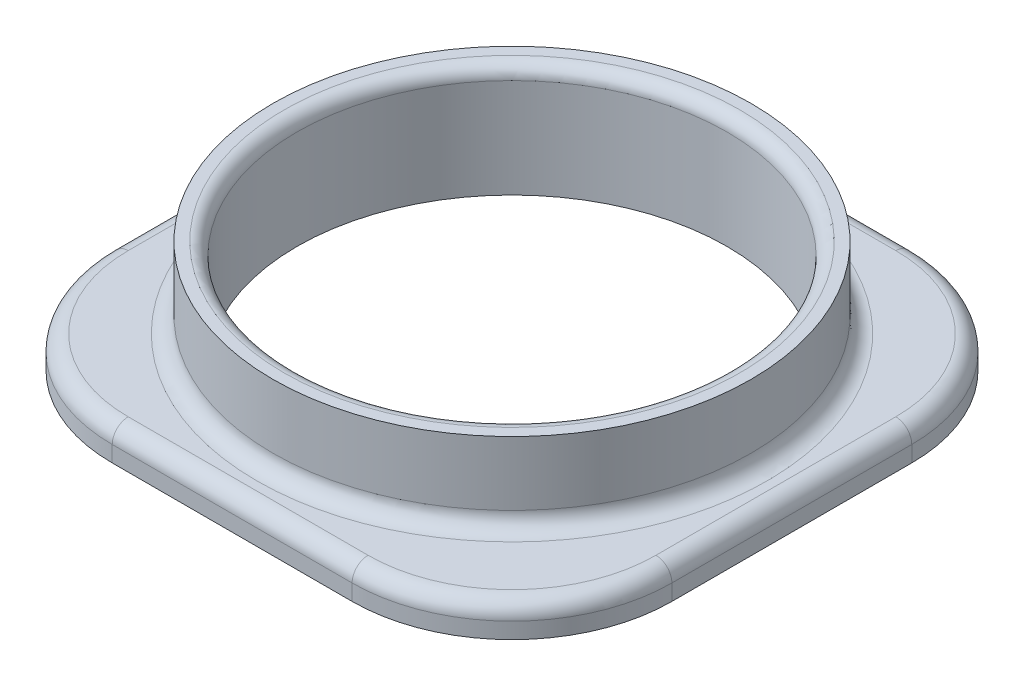
ISO-10303-21;
HEADER;
FILE_DESCRIPTION(('STEP AP214'),'2;1');
FILE_NAME('part.step','',(''),(''),'','','');
FILE_SCHEMA(('AUTOMOTIVE_DESIGN { 1 0 10303 214 1 1 1 1 }'));
ENDSEC;
DATA;
#1=APPLICATION_CONTEXT('core data for automotive mechanical design processes');
#2=APPLICATION_PROTOCOL_DEFINITION('international standard','automotive_design',2000,#1);
#3=PRODUCT_CONTEXT('',#1,'mechanical');
#4=PRODUCT('Part','Part','',(#3));
#5=PRODUCT_RELATED_PRODUCT_CATEGORY('part','',(#4));
#6=PRODUCT_DEFINITION_FORMATION('','',#4);
#7=PRODUCT_DEFINITION_CONTEXT('part definition',#1,'design');
#8=PRODUCT_DEFINITION('design','',#6,#7);
#9=PRODUCT_DEFINITION_SHAPE('','',#8);
#10=(LENGTH_UNIT() NAMED_UNIT(*) SI_UNIT(.MILLI.,.METRE.));
#11=(NAMED_UNIT(*) PLANE_ANGLE_UNIT() SI_UNIT($,.RADIAN.));
#12=(NAMED_UNIT(*) SI_UNIT($,.STERADIAN.) SOLID_ANGLE_UNIT());
#13=UNCERTAINTY_MEASURE_WITH_UNIT(LENGTH_MEASURE(1.E-05),#10,'distance_accuracy_value','');
#14=(GEOMETRIC_REPRESENTATION_CONTEXT(3) GLOBAL_UNCERTAINTY_ASSIGNED_CONTEXT((#13)) GLOBAL_UNIT_ASSIGNED_CONTEXT((#10,
#11,#12)) REPRESENTATION_CONTEXT('',''));
#15=CARTESIAN_POINT('',(0.,0.,0.));
#16=DIRECTION('',(0.,0.,1.));
#17=DIRECTION('',(1.,0.,0.));
#18=AXIS2_PLACEMENT_3D('',#15,#16,#17);
#19=CARTESIAN_POINT('',(0.,5.,0.));
#20=DIRECTION('',(0.,1.,0.));
#21=DIRECTION('',(0.,0.,1.));
#22=AXIS2_PLACEMENT_3D('',#19,#20,#21);
#23=PLANE('',#22);
#24=CARTESIAN_POINT('',(0.,5.,0.));
#25=DIRECTION('',(0.,1.,0.));
#26=DIRECTION('',(0.,0.,1.));
#27=AXIS2_PLACEMENT_3D('',#24,#25,#26);
#28=CIRCLE('',#27,14.25);
#29=CARTESIAN_POINT('',(0.,5.,14.25));
#30=VERTEX_POINT('',#29);
#31=EDGE_CURVE('E183',#30,#30,#28,.F.);
#32=ORIENTED_EDGE('',*,*,#31,.T.);
#33=EDGE_LOOP('',(#32));
#34=FACE_BOUND('',#33,.T.);
#35=CARTESIAN_POINT('',(0.,5.,0.));
#36=DIRECTION('',(0.,1.,0.));
#37=DIRECTION('',(0.,0.,1.));
#38=AXIS2_PLACEMENT_3D('',#35,#36,#37);
#39=CIRCLE('',#38,14.95);
#40=CARTESIAN_POINT('',(0.,5.,14.95));
#41=VERTEX_POINT('',#40);
#42=EDGE_CURVE('E169',#41,#41,#39,.T.);
#43=ORIENTED_EDGE('',*,*,#42,.T.);
#44=EDGE_LOOP('',(#43));
#45=FACE_BOUND('',#44,.T.);
#46=ADVANCED_FACE('F47',(#34,#45),#23,.T.);
#47=CARTESIAN_POINT('',(0.,5.,0.));
#48=DIRECTION('',(0.,-1.,0.));
#49=DIRECTION('',(0.,0.,-1.));
#50=AXIS2_PLACEMENT_3D('',#47,#48,#49);
#51=CYLINDRICAL_SURFACE('',#50,14.95);
#52=CARTESIAN_POINT('',(0.,1.,0.));
#53=DIRECTION('',(0.,1.,0.));
#54=DIRECTION('',(0.,0.,1.));
#55=AXIS2_PLACEMENT_3D('',#52,#53,#54);
#56=CIRCLE('',#55,14.95);
#57=CARTESIAN_POINT('',(0.,1.,14.95));
#58=VERTEX_POINT('',#57);
#59=EDGE_CURVE('E11',#58,#58,#56,.T.);
#60=ORIENTED_EDGE('',*,*,#59,.T.);
#61=EDGE_LOOP('',(#60));
#62=FACE_BOUND('',#61,.T.);
#63=ORIENTED_EDGE('',*,*,#42,.F.);
#64=EDGE_LOOP('',(#63));
#65=FACE_BOUND('',#64,.T.);
#66=ADVANCED_FACE('F367',(#62,#65),#51,.T.);
#67=CARTESIAN_POINT('',(0.,5.,0.));
#68=DIRECTION('',(0.,-1.,0.));
#69=DIRECTION('',(0.,0.,-1.));
#70=AXIS2_PLACEMENT_3D('',#67,#68,#69);
#71=CYLINDRICAL_SURFACE('',#70,13.45);
#72=CARTESIAN_POINT('',(0.,4.2,0.));
#73=DIRECTION('',(0.,1.,0.));
#74=DIRECTION('',(0.,0.,1.));
#75=AXIS2_PLACEMENT_3D('',#72,#73,#74);
#76=CIRCLE('',#75,13.45);
#77=CARTESIAN_POINT('',(0.,4.2,13.45));
#78=VERTEX_POINT('',#77);
#79=EDGE_CURVE('E174',#78,#78,#76,.T.);
#80=ORIENTED_EDGE('',*,*,#79,.T.);
#81=EDGE_LOOP('',(#80));
#82=FACE_BOUND('',#81,.T.);
#83=CARTESIAN_POINT('',(0.,-2.,0.));
#84=DIRECTION('',(0.,-1.,0.));
#85=DIRECTION('',(0.,0.,-1.));
#86=AXIS2_PLACEMENT_3D('',#83,#84,#85);
#87=CIRCLE('',#86,13.45);
#88=CARTESIAN_POINT('',(0.,-2.,-13.45));
#89=VERTEX_POINT('',#88);
#90=EDGE_CURVE('E164',#89,#89,#87,.T.);
#91=ORIENTED_EDGE('',*,*,#90,.T.);
#92=EDGE_LOOP('',(#91));
#93=FACE_BOUND('',#92,.T.);
#94=ADVANCED_FACE('F375',(#82,#93),#71,.F.);
#95=CARTESIAN_POINT('',(-7.5,-2.,-7.50000000000001));
#96=DIRECTION('',(0.,1.,0.));
#97=DIRECTION('',(0.,0.,1.));
#98=AXIS2_PLACEMENT_3D('',#95,#96,#97);
#99=PLANE('',#98);
#100=CARTESIAN_POINT('',(-7.5,-2.,-7.50000000000001));
#101=DIRECTION('',(0.,-1.,0.));
#102=DIRECTION('',(0.,0.,1.));
#103=AXIS2_PLACEMENT_3D('',#100,#101,#102);
#104=CIRCLE('',#103,10.);
#105=CARTESIAN_POINT('',(-17.5,-2.,-7.50000000000001));
#106=VERTEX_POINT('',#105);
#107=CARTESIAN_POINT('',(-7.5,-2.,-17.5));
#108=VERTEX_POINT('',#107);
#109=EDGE_CURVE('E155',#106,#108,#104,.T.);
#110=ORIENTED_EDGE('',*,*,#109,.T.);
#111=DIRECTION('',(1.,0.,0.));
#112=VECTOR('',#111,1.);
#113=CARTESIAN_POINT('',(-7.5,-2.,-17.5));
#114=LINE('',#113,#112);
#115=CARTESIAN_POINT('',(7.5,-2.,-17.5));
#116=VERTEX_POINT('',#115);
#117=EDGE_CURVE('E142',#108,#116,#114,.T.);
#118=ORIENTED_EDGE('',*,*,#117,.T.);
#119=CARTESIAN_POINT('',(7.5,-2.,-7.50000000000001));
#120=DIRECTION('',(0.,-1.,0.));
#121=DIRECTION('',(0.,0.,-1.));
#122=AXIS2_PLACEMENT_3D('',#119,#120,#121);
#123=CIRCLE('',#122,10.);
#124=CARTESIAN_POINT('',(17.5,-2.,-7.50000000000001));
#125=VERTEX_POINT('',#124);
#126=EDGE_CURVE('E154',#116,#125,#123,.T.);
#127=ORIENTED_EDGE('',*,*,#126,.T.);
#128=DIRECTION('',(0.,0.,1.));
#129=VECTOR('',#128,1.);
#130=CARTESIAN_POINT('',(17.5,-2.,-7.50000000000001));
#131=LINE('',#130,#129);
#132=CARTESIAN_POINT('',(17.5,-2.,7.5));
#133=VERTEX_POINT('',#132);
#134=EDGE_CURVE('E278',#125,#133,#131,.T.);
#135=ORIENTED_EDGE('',*,*,#134,.T.);
#136=CARTESIAN_POINT('',(7.5,-2.,7.5));
#137=DIRECTION('',(0.,-1.,0.));
#138=DIRECTION('',(0.,0.,1.));
#139=AXIS2_PLACEMENT_3D('',#136,#137,#138);
#140=CIRCLE('',#139,10.);
#141=CARTESIAN_POINT('',(7.5,-2.,17.5));
#142=VERTEX_POINT('',#141);
#143=EDGE_CURVE('E281',#133,#142,#140,.T.);
#144=ORIENTED_EDGE('',*,*,#143,.T.);
#145=DIRECTION('',(-1.,0.,0.));
#146=VECTOR('',#145,1.);
#147=CARTESIAN_POINT('',(-7.5,-2.,17.5));
#148=LINE('',#147,#146);
#149=CARTESIAN_POINT('',(-7.5,-2.,17.5));
#150=VERTEX_POINT('',#149);
#151=EDGE_CURVE('E284',#142,#150,#148,.T.);
#152=ORIENTED_EDGE('',*,*,#151,.T.);
#153=CARTESIAN_POINT('',(-7.5,-2.,7.5));
#154=DIRECTION('',(0.,-1.,0.));
#155=DIRECTION('',(0.,0.,1.));
#156=AXIS2_PLACEMENT_3D('',#153,#154,#155);
#157=CIRCLE('',#156,10.);
#158=CARTESIAN_POINT('',(-17.5,-2.,7.5));
#159=VERTEX_POINT('',#158);
#160=EDGE_CURVE('E287',#150,#159,#157,.T.);
#161=ORIENTED_EDGE('',*,*,#160,.T.);
#162=DIRECTION('',(0.,0.,-1.));
#163=VECTOR('',#162,1.);
#164=CARTESIAN_POINT('',(-17.5,-2.,-7.50000000000001));
#165=LINE('',#164,#163);
#166=EDGE_CURVE('E161',#159,#106,#165,.T.);
#167=ORIENTED_EDGE('',*,*,#166,.T.);
#168=EDGE_LOOP('',(#110,#118,#127,#135,#144,#152,#161,#167));
#169=FACE_BOUND('',#168,.T.);
#170=ORIENTED_EDGE('',*,*,#90,.F.);
#171=EDGE_LOOP('',(#170));
#172=FACE_BOUND('',#171,.T.);
#173=ADVANCED_FACE('F158',(#169,#172),#99,.F.);
#174=CARTESIAN_POINT('',(-7.5,0.,-7.50000000000001));
#175=DIRECTION('',(0.,1.,0.));
#176=DIRECTION('',(0.,0.,1.));
#177=AXIS2_PLACEMENT_3D('',#174,#175,#176);
#178=PLANE('',#177);
#179=CARTESIAN_POINT('',(7.5,0.,-7.50000000000001));
#180=DIRECTION('',(0.,1.,0.));
#181=DIRECTION('',(0.,0.,1.));
#182=AXIS2_PLACEMENT_3D('',#179,#180,#181);
#183=CIRCLE('',#182,9.);
#184=CARTESIAN_POINT('',(16.5,0.,-7.50000000000001));
#185=VERTEX_POINT('',#184);
#186=CARTESIAN_POINT('',(7.5,0.,-16.5));
#187=VERTEX_POINT('',#186);
#188=EDGE_CURVE('E212',#185,#187,#183,.T.);
#189=ORIENTED_EDGE('',*,*,#188,.T.);
#190=DIRECTION('',(1.,0.,0.));
#191=VECTOR('',#190,1.);
#192=CARTESIAN_POINT('',(-7.5,0.,-16.5));
#193=LINE('',#192,#191);
#194=CARTESIAN_POINT('',(-7.5,0.,-16.5));
#195=VERTEX_POINT('',#194);
#196=EDGE_CURVE('E215',#187,#195,#193,.F.);
#197=ORIENTED_EDGE('',*,*,#196,.T.);
#198=CARTESIAN_POINT('',(-7.5,0.,-7.50000000000001));
#199=DIRECTION('',(0.,1.,0.));
#200=DIRECTION('',(0.,0.,1.));
#201=AXIS2_PLACEMENT_3D('',#198,#199,#200);
#202=CIRCLE('',#201,9.);
#203=CARTESIAN_POINT('',(-16.5,0.,-7.50000000000001));
#204=VERTEX_POINT('',#203);
#205=EDGE_CURVE('E194',#195,#204,#202,.T.);
#206=ORIENTED_EDGE('',*,*,#205,.T.);
#207=DIRECTION('',(0.,0.,-1.));
#208=VECTOR('',#207,1.);
#209=CARTESIAN_POINT('',(-16.5,0.,7.5));
#210=LINE('',#209,#208);
#211=CARTESIAN_POINT('',(-16.5,0.,7.5));
#212=VERTEX_POINT('',#211);
#213=EDGE_CURVE('E197',#204,#212,#210,.F.);
#214=ORIENTED_EDGE('',*,*,#213,.T.);
#215=CARTESIAN_POINT('',(-7.5,0.,7.5));
#216=DIRECTION('',(0.,1.,0.));
#217=DIRECTION('',(0.,0.,1.));
#218=AXIS2_PLACEMENT_3D('',#215,#216,#217);
#219=CIRCLE('',#218,9.);
#220=CARTESIAN_POINT('',(-7.5,0.,16.5));
#221=VERTEX_POINT('',#220);
#222=EDGE_CURVE('E200',#212,#221,#219,.T.);
#223=ORIENTED_EDGE('',*,*,#222,.T.);
#224=DIRECTION('',(-1.,0.,0.));
#225=VECTOR('',#224,1.);
#226=CARTESIAN_POINT('',(7.5,0.,16.5));
#227=LINE('',#226,#225);
#228=CARTESIAN_POINT('',(7.5,0.,16.5));
#229=VERTEX_POINT('',#228);
#230=EDGE_CURVE('E203',#221,#229,#227,.F.);
#231=ORIENTED_EDGE('',*,*,#230,.T.);
#232=CARTESIAN_POINT('',(7.5,0.,7.5));
#233=DIRECTION('',(0.,1.,0.));
#234=DIRECTION('',(0.,0.,1.));
#235=AXIS2_PLACEMENT_3D('',#232,#233,#234);
#236=CIRCLE('',#235,9.);
#237=CARTESIAN_POINT('',(16.5,0.,7.5));
#238=VERTEX_POINT('',#237);
#239=EDGE_CURVE('E206',#229,#238,#236,.T.);
#240=ORIENTED_EDGE('',*,*,#239,.T.);
#241=DIRECTION('',(0.,0.,1.));
#242=VECTOR('',#241,1.);
#243=CARTESIAN_POINT('',(16.5,0.,-7.50000000000001));
#244=LINE('',#243,#242);
#245=EDGE_CURVE('E209',#238,#185,#244,.F.);
#246=ORIENTED_EDGE('',*,*,#245,.T.);
#247=EDGE_LOOP('',(#189,#197,#206,#214,#223,#231,#240,#246));
#248=FACE_BOUND('',#247,.T.);
#249=CARTESIAN_POINT('',(0.,0.,0.));
#250=DIRECTION('',(0.,1.,0.));
#251=DIRECTION('',(0.,0.,1.));
#252=AXIS2_PLACEMENT_3D('',#249,#250,#251);
#253=CIRCLE('',#252,15.95);
#254=CARTESIAN_POINT('',(0.,0.,15.95));
#255=VERTEX_POINT('',#254);
#256=EDGE_CURVE('E190',#255,#255,#253,.F.);
#257=ORIENTED_EDGE('',*,*,#256,.T.);
#258=EDGE_LOOP('',(#257));
#259=FACE_BOUND('',#258,.T.);
#260=ADVANCED_FACE('F329',(#248,#259),#178,.T.);
#261=CARTESIAN_POINT('',(-7.5,-2.,-7.50000000000001));
#262=DIRECTION('',(0.,1.,0.));
#263=DIRECTION('',(0.,0.,1.));
#264=AXIS2_PLACEMENT_3D('',#261,#262,#263);
#265=CYLINDRICAL_SURFACE('',#264,10.);
#266=DIRECTION('',(0.,1.,0.));
#267=VECTOR('',#266,1.);
#268=CARTESIAN_POINT('',(-17.5,-2.,-7.50000000000001));
#269=LINE('',#268,#267);
#270=CARTESIAN_POINT('',(-17.5,-1.,-7.50000000000001));
#271=VERTEX_POINT('',#270);
#272=EDGE_CURVE('E292',#106,#271,#269,.T.);
#273=ORIENTED_EDGE('',*,*,#272,.T.);
#274=CARTESIAN_POINT('',(-7.5,-1.,-7.50000000000001));
#275=DIRECTION('',(0.,1.,0.));
#276=DIRECTION('',(0.,0.,1.));
#277=AXIS2_PLACEMENT_3D('',#274,#275,#276);
#278=CIRCLE('',#277,10.);
#279=CARTESIAN_POINT('',(-7.5,-1.,-17.5));
#280=VERTEX_POINT('',#279);
#281=EDGE_CURVE('E57',#271,#280,#278,.F.);
#282=ORIENTED_EDGE('',*,*,#281,.T.);
#283=DIRECTION('',(0.,1.,0.));
#284=VECTOR('',#283,1.);
#285=CARTESIAN_POINT('',(-7.5,-2.,-17.5));
#286=LINE('',#285,#284);
#287=EDGE_CURVE('E147',#108,#280,#286,.T.);
#288=ORIENTED_EDGE('',*,*,#287,.F.);
#289=ORIENTED_EDGE('',*,*,#109,.F.);
#290=EDGE_LOOP('',(#273,#282,#288,#289));
#291=FACE_BOUND('',#290,.T.);
#292=ADVANCED_FACE('F166',(#291),#265,.T.);
#293=CARTESIAN_POINT('',(-7.5,-2.,-17.5));
#294=DIRECTION('',(0.,0.,1.));
#295=DIRECTION('',(1.,0.,0.));
#296=AXIS2_PLACEMENT_3D('',#293,#294,#295);
#297=PLANE('',#296);
#298=ORIENTED_EDGE('',*,*,#287,.T.);
#299=DIRECTION('',(1.,0.,0.));
#300=VECTOR('',#299,1.);
#301=CARTESIAN_POINT('',(7.5,-1.,-17.5));
#302=LINE('',#301,#300);
#303=CARTESIAN_POINT('',(7.5,-1.,-17.5));
#304=VERTEX_POINT('',#303);
#305=EDGE_CURVE('E187',#280,#304,#302,.T.);
#306=ORIENTED_EDGE('',*,*,#305,.T.);
#307=DIRECTION('',(0.,1.,0.));
#308=VECTOR('',#307,1.);
#309=CARTESIAN_POINT('',(7.5,-2.,-17.5));
#310=LINE('',#309,#308);
#311=EDGE_CURVE('E150',#116,#304,#310,.T.);
#312=ORIENTED_EDGE('',*,*,#311,.F.);
#313=ORIENTED_EDGE('',*,*,#117,.F.);
#314=EDGE_LOOP('',(#298,#306,#312,#313));
#315=FACE_BOUND('',#314,.T.);
#316=ADVANCED_FACE('F144',(#315),#297,.F.);
#317=CARTESIAN_POINT('',(7.5,-2.,-7.50000000000001));
#318=DIRECTION('',(0.,1.,0.));
#319=DIRECTION('',(0.,0.,1.));
#320=AXIS2_PLACEMENT_3D('',#317,#318,#319);
#321=CYLINDRICAL_SURFACE('',#320,10.);
#322=ORIENTED_EDGE('',*,*,#311,.T.);
#323=CARTESIAN_POINT('',(7.5,-1.,-7.50000000000001));
#324=DIRECTION('',(0.,1.,0.));
#325=DIRECTION('',(0.,0.,1.));
#326=AXIS2_PLACEMENT_3D('',#323,#324,#325);
#327=CIRCLE('',#326,10.);
#328=CARTESIAN_POINT('',(17.5,-1.,-7.50000000000001));
#329=VERTEX_POINT('',#328);
#330=EDGE_CURVE('E219',#304,#329,#327,.F.);
#331=ORIENTED_EDGE('',*,*,#330,.T.);
#332=DIRECTION('',(0.,1.,0.));
#333=VECTOR('',#332,1.);
#334=CARTESIAN_POINT('',(17.5,-2.,-7.50000000000001));
#335=LINE('',#334,#333);
#336=EDGE_CURVE('E176',#125,#329,#335,.T.);
#337=ORIENTED_EDGE('',*,*,#336,.F.);
#338=ORIENTED_EDGE('',*,*,#126,.F.);
#339=EDGE_LOOP('',(#322,#331,#337,#338));
#340=FACE_BOUND('',#339,.T.);
#341=ADVANCED_FACE('F357',(#340),#321,.T.);
#342=CARTESIAN_POINT('',(17.5,-2.,-7.50000000000001));
#343=DIRECTION('',(-1.,0.,0.));
#344=DIRECTION('',(0.,0.,1.));
#345=AXIS2_PLACEMENT_3D('',#342,#343,#344);
#346=PLANE('',#345);
#347=ORIENTED_EDGE('',*,*,#336,.T.);
#348=DIRECTION('',(0.,0.,1.));
#349=VECTOR('',#348,1.);
#350=CARTESIAN_POINT('',(17.5,-1.,7.5));
#351=LINE('',#350,#349);
#352=CARTESIAN_POINT('',(17.5,-1.,7.5));
#353=VERTEX_POINT('',#352);
#354=EDGE_CURVE('E222',#329,#353,#351,.T.);
#355=ORIENTED_EDGE('',*,*,#354,.T.);
#356=DIRECTION('',(0.,1.,0.));
#357=VECTOR('',#356,1.);
#358=CARTESIAN_POINT('',(17.5,-2.,7.5));
#359=LINE('',#358,#357);
#360=EDGE_CURVE('E305',#133,#353,#359,.T.);
#361=ORIENTED_EDGE('',*,*,#360,.F.);
#362=ORIENTED_EDGE('',*,*,#134,.F.);
#363=EDGE_LOOP('',(#347,#355,#361,#362));
#364=FACE_BOUND('',#363,.T.);
#365=ADVANCED_FACE('F314',(#364),#346,.F.);
#366=CARTESIAN_POINT('',(7.5,-2.,7.5));
#367=DIRECTION('',(0.,1.,0.));
#368=DIRECTION('',(0.,0.,1.));
#369=AXIS2_PLACEMENT_3D('',#366,#367,#368);
#370=CYLINDRICAL_SURFACE('',#369,10.);
#371=ORIENTED_EDGE('',*,*,#360,.T.);
#372=CARTESIAN_POINT('',(7.5,-1.,7.5));
#373=DIRECTION('',(0.,1.,0.));
#374=DIRECTION('',(0.,0.,1.));
#375=AXIS2_PLACEMENT_3D('',#372,#373,#374);
#376=CIRCLE('',#375,10.);
#377=CARTESIAN_POINT('',(7.5,-1.,17.5));
#378=VERTEX_POINT('',#377);
#379=EDGE_CURVE('E225',#353,#378,#376,.F.);
#380=ORIENTED_EDGE('',*,*,#379,.T.);
#381=DIRECTION('',(0.,1.,0.));
#382=VECTOR('',#381,1.);
#383=CARTESIAN_POINT('',(7.5,-2.,17.5));
#384=LINE('',#383,#382);
#385=EDGE_CURVE('E301',#142,#378,#384,.T.);
#386=ORIENTED_EDGE('',*,*,#385,.F.);
#387=ORIENTED_EDGE('',*,*,#143,.F.);
#388=EDGE_LOOP('',(#371,#380,#386,#387));
#389=FACE_BOUND('',#388,.T.);
#390=ADVANCED_FACE('F350',(#389),#370,.T.);
#391=CARTESIAN_POINT('',(-7.5,-2.,17.5));
#392=DIRECTION('',(0.,0.,-1.));
#393=DIRECTION('',(-1.,0.,0.));
#394=AXIS2_PLACEMENT_3D('',#391,#392,#393);
#395=PLANE('',#394);
#396=ORIENTED_EDGE('',*,*,#385,.T.);
#397=DIRECTION('',(-1.,0.,0.));
#398=VECTOR('',#397,1.);
#399=CARTESIAN_POINT('',(-7.5,-1.,17.5));
#400=LINE('',#399,#398);
#401=CARTESIAN_POINT('',(-7.5,-1.,17.5));
#402=VERTEX_POINT('',#401);
#403=EDGE_CURVE('E228',#378,#402,#400,.T.);
#404=ORIENTED_EDGE('',*,*,#403,.T.);
#405=DIRECTION('',(0.,1.,0.));
#406=VECTOR('',#405,1.);
#407=CARTESIAN_POINT('',(-7.5,-2.,17.5));
#408=LINE('',#407,#406);
#409=EDGE_CURVE('E298',#150,#402,#408,.T.);
#410=ORIENTED_EDGE('',*,*,#409,.F.);
#411=ORIENTED_EDGE('',*,*,#151,.F.);
#412=EDGE_LOOP('',(#396,#404,#410,#411));
#413=FACE_BOUND('',#412,.T.);
#414=ADVANCED_FACE('F354',(#413),#395,.F.);
#415=CARTESIAN_POINT('',(-7.5,-2.,7.5));
#416=DIRECTION('',(0.,1.,0.));
#417=DIRECTION('',(0.,0.,1.));
#418=AXIS2_PLACEMENT_3D('',#415,#416,#417);
#419=CYLINDRICAL_SURFACE('',#418,10.);
#420=ORIENTED_EDGE('',*,*,#409,.T.);
#421=CARTESIAN_POINT('',(-7.5,-1.,7.5));
#422=DIRECTION('',(0.,1.,0.));
#423=DIRECTION('',(0.,0.,1.));
#424=AXIS2_PLACEMENT_3D('',#421,#422,#423);
#425=CIRCLE('',#424,10.);
#426=CARTESIAN_POINT('',(-17.5,-1.,7.5));
#427=VERTEX_POINT('',#426);
#428=EDGE_CURVE('E73',#402,#427,#425,.F.);
#429=ORIENTED_EDGE('',*,*,#428,.T.);
#430=DIRECTION('',(0.,1.,0.));
#431=VECTOR('',#430,1.);
#432=CARTESIAN_POINT('',(-17.5,-2.,7.5));
#433=LINE('',#432,#431);
#434=EDGE_CURVE('E295',#159,#427,#433,.T.);
#435=ORIENTED_EDGE('',*,*,#434,.F.);
#436=ORIENTED_EDGE('',*,*,#160,.F.);
#437=EDGE_LOOP('',(#420,#429,#435,#436));
#438=FACE_BOUND('',#437,.T.);
#439=ADVANCED_FACE('F469',(#438),#419,.T.);
#440=CARTESIAN_POINT('',(-17.5,-2.,-7.50000000000001));
#441=DIRECTION('',(1.,0.,0.));
#442=DIRECTION('',(0.,0.,-1.));
#443=AXIS2_PLACEMENT_3D('',#440,#441,#442);
#444=PLANE('',#443);
#445=ORIENTED_EDGE('',*,*,#434,.T.);
#446=DIRECTION('',(0.,0.,-1.));
#447=VECTOR('',#446,1.);
#448=CARTESIAN_POINT('',(-17.5,-1.,-7.50000000000001));
#449=LINE('',#448,#447);
#450=EDGE_CURVE('E65',#427,#271,#449,.T.);
#451=ORIENTED_EDGE('',*,*,#450,.T.);
#452=ORIENTED_EDGE('',*,*,#272,.F.);
#453=ORIENTED_EDGE('',*,*,#166,.F.);
#454=EDGE_LOOP('',(#445,#451,#452,#453));
#455=FACE_BOUND('',#454,.T.);
#456=ADVANCED_FACE('F385',(#455),#444,.F.);
#457=CARTESIAN_POINT('',(0.,4.2,0.));
#458=DIRECTION('',(0.,1.,0.));
#459=DIRECTION('',(0.,0.,1.));
#460=AXIS2_PLACEMENT_3D('',#457,#458,#459);
#461=TOROIDAL_SURFACE('',#460,14.25,0.8);
#462=ORIENTED_EDGE('',*,*,#31,.F.);
#463=EDGE_LOOP('',(#462));
#464=FACE_BOUND('',#463,.T.);
#465=ORIENTED_EDGE('',*,*,#79,.F.);
#466=EDGE_LOOP('',(#465));
#467=FACE_BOUND('',#466,.T.);
#468=ADVANCED_FACE('F382',(#464,#467),#461,.T.);
#469=CARTESIAN_POINT('',(-7.5,-1.,16.5));
#470=DIRECTION('',(1.,0.,0.));
#471=DIRECTION('',(0.,0.,-1.));
#472=AXIS2_PLACEMENT_3D('',#469,#470,#471);
#473=CYLINDRICAL_SURFACE('',#472,1.);
#474=CARTESIAN_POINT('',(7.5,-1.,16.5));
#475=DIRECTION('',(1.,0.,0.));
#476=DIRECTION('',(0.,0.,-1.));
#477=AXIS2_PLACEMENT_3D('',#474,#475,#476);
#478=CIRCLE('',#477,1.);
#479=EDGE_CURVE('E258',#229,#378,#478,.T.);
#480=ORIENTED_EDGE('',*,*,#479,.F.);
#481=ORIENTED_EDGE('',*,*,#230,.F.);
#482=CARTESIAN_POINT('',(-7.5,-1.,16.5));
#483=DIRECTION('',(-1.,0.,0.));
#484=DIRECTION('',(0.,0.,1.));
#485=AXIS2_PLACEMENT_3D('',#482,#483,#484);
#486=CIRCLE('',#485,1.);
#487=EDGE_CURVE('E51',#402,#221,#486,.T.);
#488=ORIENTED_EDGE('',*,*,#487,.F.);
#489=ORIENTED_EDGE('',*,*,#403,.F.);
#490=EDGE_LOOP('',(#480,#481,#488,#489));
#491=FACE_BOUND('',#490,.T.);
#492=ADVANCED_FACE('F345',(#491),#473,.T.);
#493=CARTESIAN_POINT('',(-7.5,-1.,7.5));
#494=DIRECTION('',(0.,1.,0.));
#495=DIRECTION('',(0.,0.,1.));
#496=AXIS2_PLACEMENT_3D('',#493,#494,#495);
#497=TOROIDAL_SURFACE('',#496,9.,1.);
#498=ORIENTED_EDGE('',*,*,#487,.T.);
#499=ORIENTED_EDGE('',*,*,#222,.F.);
#500=CARTESIAN_POINT('',(-16.5,-1.,7.5));
#501=DIRECTION('',(0.,0.,-1.));
#502=DIRECTION('',(-1.,0.,0.));
#503=AXIS2_PLACEMENT_3D('',#500,#501,#502);
#504=CIRCLE('',#503,1.);
#505=EDGE_CURVE('E255',#427,#212,#504,.T.);
#506=ORIENTED_EDGE('',*,*,#505,.F.);
#507=ORIENTED_EDGE('',*,*,#428,.F.);
#508=EDGE_LOOP('',(#498,#499,#506,#507));
#509=FACE_BOUND('',#508,.T.);
#510=ADVANCED_FACE('F342',(#509),#497,.T.);
#511=CARTESIAN_POINT('',(7.5,-1.,7.5));
#512=DIRECTION('',(0.,1.,0.));
#513=DIRECTION('',(0.,0.,1.));
#514=AXIS2_PLACEMENT_3D('',#511,#512,#513);
#515=TOROIDAL_SURFACE('',#514,9.,1.);
#516=ORIENTED_EDGE('',*,*,#479,.T.);
#517=ORIENTED_EDGE('',*,*,#379,.F.);
#518=CARTESIAN_POINT('',(16.5,-1.,7.5));
#519=DIRECTION('',(0.,0.,-1.));
#520=DIRECTION('',(-1.,0.,0.));
#521=AXIS2_PLACEMENT_3D('',#518,#519,#520);
#522=CIRCLE('',#521,1.);
#523=EDGE_CURVE('E251',#238,#353,#522,.T.);
#524=ORIENTED_EDGE('',*,*,#523,.F.);
#525=ORIENTED_EDGE('',*,*,#239,.F.);
#526=EDGE_LOOP('',(#516,#517,#524,#525));
#527=FACE_BOUND('',#526,.T.);
#528=ADVANCED_FACE('F347',(#527),#515,.T.);
#529=CARTESIAN_POINT('',(-16.5,-1.,-7.50000000000001));
#530=DIRECTION('',(0.,0.,1.));
#531=DIRECTION('',(1.,0.,0.));
#532=AXIS2_PLACEMENT_3D('',#529,#530,#531);
#533=CYLINDRICAL_SURFACE('',#532,1.);
#534=ORIENTED_EDGE('',*,*,#505,.T.);
#535=ORIENTED_EDGE('',*,*,#213,.F.);
#536=CARTESIAN_POINT('',(-16.5,-1.,-7.50000000000001));
#537=DIRECTION('',(0.,0.,-1.));
#538=DIRECTION('',(-1.,0.,0.));
#539=AXIS2_PLACEMENT_3D('',#536,#537,#538);
#540=CIRCLE('',#539,1.);
#541=EDGE_CURVE('E247',#271,#204,#540,.T.);
#542=ORIENTED_EDGE('',*,*,#541,.F.);
#543=ORIENTED_EDGE('',*,*,#450,.F.);
#544=EDGE_LOOP('',(#534,#535,#542,#543));
#545=FACE_BOUND('',#544,.T.);
#546=ADVANCED_FACE('F340',(#545),#533,.T.);
#547=CARTESIAN_POINT('',(16.5,-1.,-7.50000000000001));
#548=DIRECTION('',(0.,0.,-1.));
#549=DIRECTION('',(-1.,0.,0.));
#550=AXIS2_PLACEMENT_3D('',#547,#548,#549);
#551=CYLINDRICAL_SURFACE('',#550,1.);
#552=ORIENTED_EDGE('',*,*,#523,.T.);
#553=ORIENTED_EDGE('',*,*,#354,.F.);
#554=CARTESIAN_POINT('',(16.5,-1.,-7.50000000000001));
#555=DIRECTION('',(0.,0.,-1.));
#556=DIRECTION('',(-1.,0.,0.));
#557=AXIS2_PLACEMENT_3D('',#554,#555,#556);
#558=CIRCLE('',#557,1.);
#559=EDGE_CURVE('E243',#185,#329,#558,.T.);
#560=ORIENTED_EDGE('',*,*,#559,.F.);
#561=ORIENTED_EDGE('',*,*,#245,.F.);
#562=EDGE_LOOP('',(#552,#553,#560,#561));
#563=FACE_BOUND('',#562,.T.);
#564=ADVANCED_FACE('F319',(#563),#551,.T.);
#565=CARTESIAN_POINT('',(-7.5,-1.,-7.50000000000001));
#566=DIRECTION('',(0.,1.,0.));
#567=DIRECTION('',(0.,0.,1.));
#568=AXIS2_PLACEMENT_3D('',#565,#566,#567);
#569=TOROIDAL_SURFACE('',#568,9.,1.);
#570=ORIENTED_EDGE('',*,*,#541,.T.);
#571=ORIENTED_EDGE('',*,*,#205,.F.);
#572=CARTESIAN_POINT('',(-7.5,-1.,-16.5));
#573=DIRECTION('',(1.,0.,0.));
#574=DIRECTION('',(0.,0.,-1.));
#575=AXIS2_PLACEMENT_3D('',#572,#573,#574);
#576=CIRCLE('',#575,1.);
#577=EDGE_CURVE('E240',#280,#195,#576,.T.);
#578=ORIENTED_EDGE('',*,*,#577,.F.);
#579=ORIENTED_EDGE('',*,*,#281,.F.);
#580=EDGE_LOOP('',(#570,#571,#578,#579));
#581=FACE_BOUND('',#580,.T.);
#582=ADVANCED_FACE('F336',(#581),#569,.T.);
#583=CARTESIAN_POINT('',(7.5,-1.,-7.50000000000001));
#584=DIRECTION('',(0.,1.,0.));
#585=DIRECTION('',(0.,0.,1.));
#586=AXIS2_PLACEMENT_3D('',#583,#584,#585);
#587=TOROIDAL_SURFACE('',#586,9.,1.);
#588=ORIENTED_EDGE('',*,*,#559,.T.);
#589=ORIENTED_EDGE('',*,*,#330,.F.);
#590=CARTESIAN_POINT('',(7.5,-1.,-16.5));
#591=DIRECTION('',(-1.,0.,0.));
#592=DIRECTION('',(0.,0.,1.));
#593=AXIS2_PLACEMENT_3D('',#590,#591,#592);
#594=CIRCLE('',#593,1.);
#595=EDGE_CURVE('E237',#187,#304,#594,.T.);
#596=ORIENTED_EDGE('',*,*,#595,.F.);
#597=ORIENTED_EDGE('',*,*,#188,.F.);
#598=EDGE_LOOP('',(#588,#589,#596,#597));
#599=FACE_BOUND('',#598,.T.);
#600=ADVANCED_FACE('F325',(#599),#587,.T.);
#601=CARTESIAN_POINT('',(-7.5,-1.,-16.5));
#602=DIRECTION('',(-1.,0.,0.));
#603=DIRECTION('',(0.,0.,1.));
#604=AXIS2_PLACEMENT_3D('',#601,#602,#603);
#605=CYLINDRICAL_SURFACE('',#604,1.);
#606=ORIENTED_EDGE('',*,*,#577,.T.);
#607=ORIENTED_EDGE('',*,*,#196,.F.);
#608=ORIENTED_EDGE('',*,*,#595,.T.);
#609=ORIENTED_EDGE('',*,*,#305,.F.);
#610=EDGE_LOOP('',(#606,#607,#608,#609));
#611=FACE_BOUND('',#610,.T.);
#612=ADVANCED_FACE('F332',(#611),#605,.T.);
#613=CARTESIAN_POINT('',(0.,1.,0.));
#614=DIRECTION('',(0.,1.,0.));
#615=DIRECTION('',(0.,0.,1.));
#616=AXIS2_PLACEMENT_3D('',#613,#614,#615);
#617=TOROIDAL_SURFACE('',#616,15.95,1.);
#618=ORIENTED_EDGE('',*,*,#256,.F.);
#619=EDGE_LOOP('',(#618));
#620=FACE_BOUND('',#619,.T.);
#621=ORIENTED_EDGE('',*,*,#59,.F.);
#622=EDGE_LOOP('',(#621));
#623=FACE_BOUND('',#622,.T.);
#624=ADVANCED_FACE('F49',(#620,#623),#617,.F.);
#625=CLOSED_SHELL('',(#46,#66,#94,#173,#260,#292,#316,#341,#365,#390,#414,#439,#456,#468,#492,
#510,#528,#546,#564,#582,#600,#612,#624));
#626=MANIFOLD_SOLID_BREP('B2',#625);
#627=ADVANCED_BREP_SHAPE_REPRESENTATION('',(#18,#626),#14);
#628=SHAPE_DEFINITION_REPRESENTATION(#9,#627);
ENDSEC;
END-ISO-10303-21;
